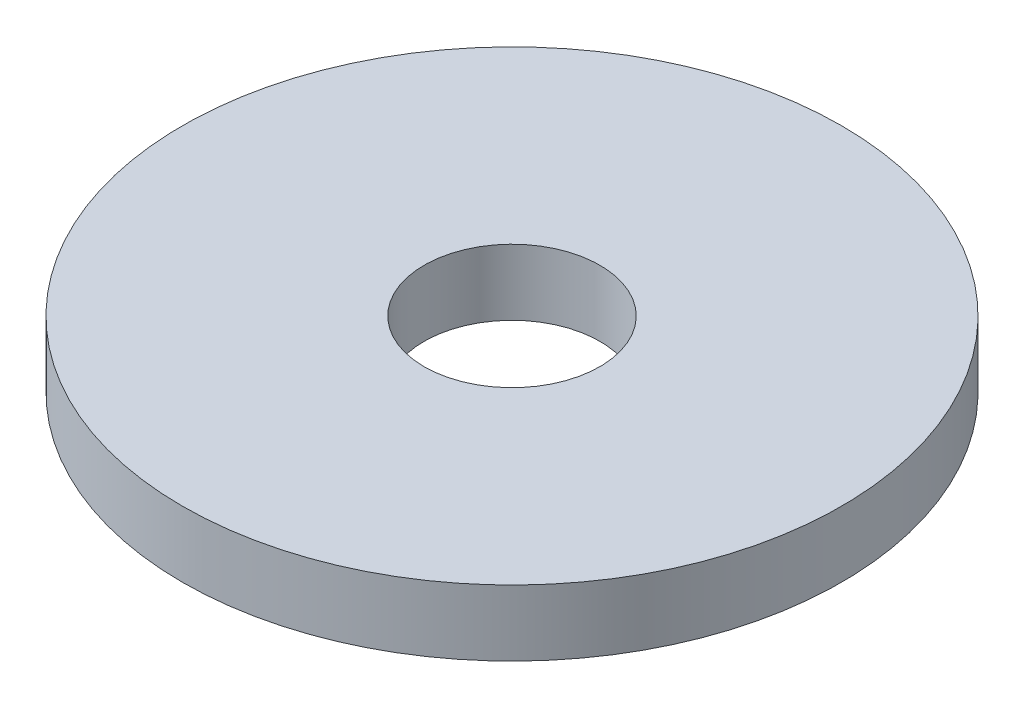
ISO-10303-21;
HEADER;
FILE_DESCRIPTION(('STEP AP214'),'2;1');
FILE_NAME('part.step','',(''),(''),'','','');
FILE_SCHEMA(('AUTOMOTIVE_DESIGN { 1 0 10303 214 1 1 1 1 }'));
ENDSEC;
DATA;
#1=APPLICATION_CONTEXT('core data for automotive mechanical design processes');
#2=APPLICATION_PROTOCOL_DEFINITION('international standard','automotive_design',2000,#1);
#3=PRODUCT_CONTEXT('',#1,'mechanical');
#4=PRODUCT('Part','Part','',(#3));
#5=PRODUCT_RELATED_PRODUCT_CATEGORY('part','',(#4));
#6=PRODUCT_DEFINITION_FORMATION('','',#4);
#7=PRODUCT_DEFINITION_CONTEXT('part definition',#1,'design');
#8=PRODUCT_DEFINITION('design','',#6,#7);
#9=PRODUCT_DEFINITION_SHAPE('','',#8);
#10=(LENGTH_UNIT() NAMED_UNIT(*) SI_UNIT(.MILLI.,.METRE.));
#11=(NAMED_UNIT(*) PLANE_ANGLE_UNIT() SI_UNIT($,.RADIAN.));
#12=(NAMED_UNIT(*) SI_UNIT($,.STERADIAN.) SOLID_ANGLE_UNIT());
#13=UNCERTAINTY_MEASURE_WITH_UNIT(LENGTH_MEASURE(1.E-05),#10,'distance_accuracy_value','');
#14=(GEOMETRIC_REPRESENTATION_CONTEXT(3) GLOBAL_UNCERTAINTY_ASSIGNED_CONTEXT((#13)) GLOBAL_UNIT_ASSIGNED_CONTEXT((#10,
#11,#12)) REPRESENTATION_CONTEXT('',''));
#15=CARTESIAN_POINT('',(0.,0.,0.));
#16=DIRECTION('',(0.,0.,1.));
#17=DIRECTION('',(1.,0.,0.));
#18=AXIS2_PLACEMENT_3D('',#15,#16,#17);
#19=CARTESIAN_POINT('',(0.,3.,0.));
#20=DIRECTION('',(0.,-1.,0.));
#21=DIRECTION('',(0.,0.,-1.));
#22=AXIS2_PLACEMENT_3D('',#19,#20,#21);
#23=PLANE('',#22);
#24=CARTESIAN_POINT('',(0.,3.,0.));
#25=DIRECTION('',(0.,1.,0.));
#26=DIRECTION('',(0.,0.,1.));
#27=AXIS2_PLACEMENT_3D('',#24,#25,#26);
#28=CIRCLE('',#27,4.);
#29=CARTESIAN_POINT('',(0.,3.,4.));
#30=VERTEX_POINT('',#29);
#31=EDGE_CURVE('E46',#30,#30,#28,.T.);
#32=ORIENTED_EDGE('',*,*,#31,.F.);
#33=EDGE_LOOP('',(#32));
#34=FACE_BOUND('',#33,.T.);
#35=CARTESIAN_POINT('',(0.,3.,0.));
#36=DIRECTION('',(0.,1.,0.));
#37=DIRECTION('',(0.,0.,1.));
#38=AXIS2_PLACEMENT_3D('',#35,#36,#37);
#39=CIRCLE('',#38,15.);
#40=CARTESIAN_POINT('',(0.,3.,15.));
#41=VERTEX_POINT('',#40);
#42=EDGE_CURVE('E40',#41,#41,#39,.T.);
#43=ORIENTED_EDGE('',*,*,#42,.T.);
#44=EDGE_LOOP('',(#43));
#45=FACE_BOUND('',#44,.T.);
#46=ADVANCED_FACE('F33',(#34,#45),#23,.F.);
#47=CARTESIAN_POINT('',(0.,0.,0.));
#48=DIRECTION('',(0.,1.,0.));
#49=DIRECTION('',(0.,0.,1.));
#50=AXIS2_PLACEMENT_3D('',#47,#48,#49);
#51=PLANE('',#50);
#52=CARTESIAN_POINT('',(0.,0.,0.));
#53=DIRECTION('',(0.,1.,0.));
#54=DIRECTION('',(0.,0.,1.));
#55=AXIS2_PLACEMENT_3D('',#52,#53,#54);
#56=CIRCLE('',#55,4.);
#57=CARTESIAN_POINT('',(0.,0.,4.));
#58=VERTEX_POINT('',#57);
#59=EDGE_CURVE('E36',#58,#58,#56,.T.);
#60=ORIENTED_EDGE('',*,*,#59,.T.);
#61=EDGE_LOOP('',(#60));
#62=FACE_BOUND('',#61,.T.);
#63=CARTESIAN_POINT('',(0.,0.,0.));
#64=DIRECTION('',(0.,1.,0.));
#65=DIRECTION('',(0.,0.,1.));
#66=AXIS2_PLACEMENT_3D('',#63,#64,#65);
#67=CIRCLE('',#66,15.);
#68=CARTESIAN_POINT('',(0.,0.,15.));
#69=VERTEX_POINT('',#68);
#70=EDGE_CURVE('E10',#69,#69,#67,.T.);
#71=ORIENTED_EDGE('',*,*,#70,.F.);
#72=EDGE_LOOP('',(#71));
#73=FACE_BOUND('',#72,.T.);
#74=ADVANCED_FACE('F53',(#62,#73),#51,.F.);
#75=CARTESIAN_POINT('',(0.,3.,0.));
#76=DIRECTION('',(0.,1.,0.));
#77=DIRECTION('',(0.,0.,1.));
#78=AXIS2_PLACEMENT_3D('',#75,#76,#77);
#79=CYLINDRICAL_SURFACE('',#78,15.);
#80=ORIENTED_EDGE('',*,*,#42,.F.);
#81=EDGE_LOOP('',(#80));
#82=FACE_BOUND('',#81,.T.);
#83=ORIENTED_EDGE('',*,*,#70,.T.);
#84=EDGE_LOOP('',(#83));
#85=FACE_BOUND('',#84,.T.);
#86=ADVANCED_FACE('F58',(#82,#85),#79,.T.);
#87=CARTESIAN_POINT('',(0.,-7.,0.));
#88=DIRECTION('',(0.,1.,0.));
#89=DIRECTION('',(0.,0.,1.));
#90=AXIS2_PLACEMENT_3D('',#87,#88,#89);
#91=CYLINDRICAL_SURFACE('',#90,4.);
#92=ORIENTED_EDGE('',*,*,#31,.T.);
#93=EDGE_LOOP('',(#92));
#94=FACE_BOUND('',#93,.T.);
#95=ORIENTED_EDGE('',*,*,#59,.F.);
#96=EDGE_LOOP('',(#95));
#97=FACE_BOUND('',#96,.T.);
#98=ADVANCED_FACE('F56',(#94,#97),#91,.F.);
#99=CLOSED_SHELL('',(#46,#74,#86,#98));
#100=MANIFOLD_SOLID_BREP('B2',#99);
#101=ADVANCED_BREP_SHAPE_REPRESENTATION('',(#18,#100),#14);
#102=SHAPE_DEFINITION_REPRESENTATION(#9,#101);
ENDSEC;
END-ISO-10303-21;
